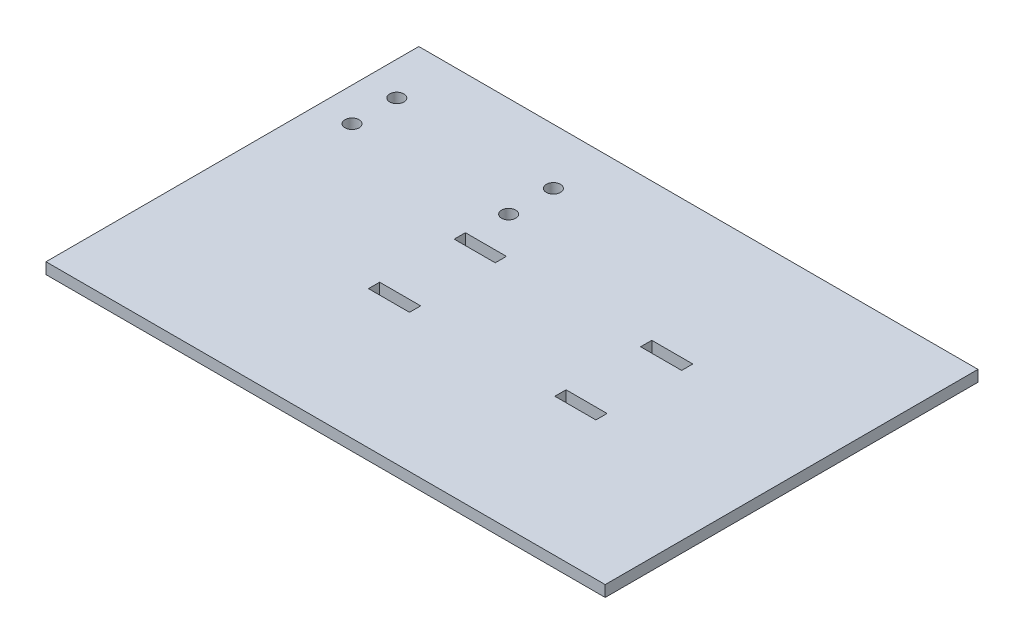
ISO-10303-21;
HEADER;
FILE_DESCRIPTION(('STEP AP214'),'2;1');
FILE_NAME('part.step','',(''),(''),'','','');
FILE_SCHEMA(('AUTOMOTIVE_DESIGN { 1 0 10303 214 1 1 1 1 }'));
ENDSEC;
DATA;
#1=APPLICATION_CONTEXT('core data for automotive mechanical design processes');
#2=APPLICATION_PROTOCOL_DEFINITION('international standard','automotive_design',2000,#1);
#3=PRODUCT_CONTEXT('',#1,'mechanical');
#4=PRODUCT('Part','Part','',(#3));
#5=PRODUCT_RELATED_PRODUCT_CATEGORY('part','',(#4));
#6=PRODUCT_DEFINITION_FORMATION('','',#4);
#7=PRODUCT_DEFINITION_CONTEXT('part definition',#1,'design');
#8=PRODUCT_DEFINITION('design','',#6,#7);
#9=PRODUCT_DEFINITION_SHAPE('','',#8);
#10=(LENGTH_UNIT() NAMED_UNIT(*) SI_UNIT(.MILLI.,.METRE.));
#11=(NAMED_UNIT(*) PLANE_ANGLE_UNIT() SI_UNIT($,.RADIAN.));
#12=(NAMED_UNIT(*) SI_UNIT($,.STERADIAN.) SOLID_ANGLE_UNIT());
#13=UNCERTAINTY_MEASURE_WITH_UNIT(LENGTH_MEASURE(1.E-05),#10,'distance_accuracy_value','');
#14=(GEOMETRIC_REPRESENTATION_CONTEXT(3) GLOBAL_UNCERTAINTY_ASSIGNED_CONTEXT((#13)) GLOBAL_UNIT_ASSIGNED_CONTEXT((#10,
#11,#12)) REPRESENTATION_CONTEXT('',''));
#15=CARTESIAN_POINT('',(0.,0.,0.));
#16=DIRECTION('',(0.,0.,1.));
#17=DIRECTION('',(1.,0.,0.));
#18=AXIS2_PLACEMENT_3D('',#15,#16,#17);
#19=CARTESIAN_POINT('',(120.,-3.,-50.));
#20=DIRECTION('',(1.,0.,0.));
#21=DIRECTION('',(0.,0.,-1.));
#22=AXIS2_PLACEMENT_3D('',#19,#20,#21);
#23=PLANE('',#22);
#24=DIRECTION('',(0.,0.,-1.));
#25=VECTOR('',#24,1.);
#26=CARTESIAN_POINT('',(120.,0.,-50.));
#27=LINE('',#26,#25);
#28=CARTESIAN_POINT('',(120.,0.,50.));
#29=VERTEX_POINT('',#28);
#30=CARTESIAN_POINT('',(120.,0.,-50.));
#31=VERTEX_POINT('',#30);
#32=EDGE_CURVE('E272',#29,#31,#27,.T.);
#33=ORIENTED_EDGE('',*,*,#32,.F.);
#34=DIRECTION('',(0.,1.,0.));
#35=VECTOR('',#34,1.);
#36=CARTESIAN_POINT('',(120.,-3.,50.));
#37=LINE('',#36,#35);
#38=CARTESIAN_POINT('',(120.,-3.,50.));
#39=VERTEX_POINT('',#38);
#40=EDGE_CURVE('E297',#39,#29,#37,.T.);
#41=ORIENTED_EDGE('',*,*,#40,.F.);
#42=DIRECTION('',(0.,0.,-1.));
#43=VECTOR('',#42,1.);
#44=CARTESIAN_POINT('',(120.,-3.,-50.));
#45=LINE('',#44,#43);
#46=CARTESIAN_POINT('',(120.,-3.,-50.));
#47=VERTEX_POINT('',#46);
#48=EDGE_CURVE('E273',#39,#47,#45,.T.);
#49=ORIENTED_EDGE('',*,*,#48,.T.);
#50=DIRECTION('',(0.,1.,0.));
#51=VECTOR('',#50,1.);
#52=CARTESIAN_POINT('',(120.,-3.,-50.));
#53=LINE('',#52,#51);
#54=EDGE_CURVE('E286',#47,#31,#53,.T.);
#55=ORIENTED_EDGE('',*,*,#54,.T.);
#56=EDGE_LOOP('',(#33,#41,#49,#55));
#57=FACE_BOUND('',#56,.T.);
#58=ADVANCED_FACE('F36',(#57),#23,.T.);
#59=CARTESIAN_POINT('',(-30.,-3.,50.));
#60=DIRECTION('',(0.,0.,1.));
#61=DIRECTION('',(1.,0.,0.));
#62=AXIS2_PLACEMENT_3D('',#59,#60,#61);
#63=PLANE('',#62);
#64=DIRECTION('',(1.,0.,0.));
#65=VECTOR('',#64,1.);
#66=CARTESIAN_POINT('',(-30.,0.,50.));
#67=LINE('',#66,#65);
#68=CARTESIAN_POINT('',(-30.,0.,50.));
#69=VERTEX_POINT('',#68);
#70=EDGE_CURVE('E277',#69,#29,#67,.T.);
#71=ORIENTED_EDGE('',*,*,#70,.F.);
#72=DIRECTION('',(0.,1.,0.));
#73=VECTOR('',#72,1.);
#74=CARTESIAN_POINT('',(-30.,-3.,50.));
#75=LINE('',#74,#73);
#76=CARTESIAN_POINT('',(-30.,-3.,50.));
#77=VERTEX_POINT('',#76);
#78=EDGE_CURVE('E300',#77,#69,#75,.T.);
#79=ORIENTED_EDGE('',*,*,#78,.F.);
#80=DIRECTION('',(1.,0.,0.));
#81=VECTOR('',#80,1.);
#82=CARTESIAN_POINT('',(-30.,-3.,50.));
#83=LINE('',#82,#81);
#84=EDGE_CURVE('E283',#77,#39,#83,.T.);
#85=ORIENTED_EDGE('',*,*,#84,.T.);
#86=ORIENTED_EDGE('',*,*,#40,.T.);
#87=EDGE_LOOP('',(#71,#79,#85,#86));
#88=FACE_BOUND('',#87,.T.);
#89=ADVANCED_FACE('F378',(#88),#63,.T.);
#90=CARTESIAN_POINT('',(-30.,-3.,-50.));
#91=DIRECTION('',(-1.,0.,0.));
#92=DIRECTION('',(0.,0.,1.));
#93=AXIS2_PLACEMENT_3D('',#90,#91,#92);
#94=PLANE('',#93);
#95=DIRECTION('',(0.,0.,1.));
#96=VECTOR('',#95,1.);
#97=CARTESIAN_POINT('',(-30.,0.,-50.));
#98=LINE('',#97,#96);
#99=CARTESIAN_POINT('',(-30.,0.,-50.));
#100=VERTEX_POINT('',#99);
#101=EDGE_CURVE('E292',#100,#69,#98,.T.);
#102=ORIENTED_EDGE('',*,*,#101,.F.);
#103=DIRECTION('',(0.,1.,0.));
#104=VECTOR('',#103,1.);
#105=CARTESIAN_POINT('',(-30.,-3.,-50.));
#106=LINE('',#105,#104);
#107=CARTESIAN_POINT('',(-30.,-3.,-50.));
#108=VERTEX_POINT('',#107);
#109=EDGE_CURVE('E302',#108,#100,#106,.T.);
#110=ORIENTED_EDGE('',*,*,#109,.F.);
#111=DIRECTION('',(0.,0.,1.));
#112=VECTOR('',#111,1.);
#113=CARTESIAN_POINT('',(-30.,-3.,-50.));
#114=LINE('',#113,#112);
#115=EDGE_CURVE('E280',#108,#77,#114,.T.);
#116=ORIENTED_EDGE('',*,*,#115,.T.);
#117=ORIENTED_EDGE('',*,*,#78,.T.);
#118=EDGE_LOOP('',(#102,#110,#116,#117));
#119=FACE_BOUND('',#118,.T.);
#120=ADVANCED_FACE('F384',(#119),#94,.T.);
#121=CARTESIAN_POINT('',(-30.,-3.,-50.));
#122=DIRECTION('',(0.,0.,-1.));
#123=DIRECTION('',(-1.,0.,0.));
#124=AXIS2_PLACEMENT_3D('',#121,#122,#123);
#125=PLANE('',#124);
#126=DIRECTION('',(-1.,0.,0.));
#127=VECTOR('',#126,1.);
#128=CARTESIAN_POINT('',(-30.,0.,-50.));
#129=LINE('',#128,#127);
#130=EDGE_CURVE('E289',#31,#100,#129,.T.);
#131=ORIENTED_EDGE('',*,*,#130,.F.);
#132=ORIENTED_EDGE('',*,*,#54,.F.);
#133=DIRECTION('',(-1.,0.,0.));
#134=VECTOR('',#133,1.);
#135=CARTESIAN_POINT('',(-30.,-3.,-50.));
#136=LINE('',#135,#134);
#137=EDGE_CURVE('E276',#47,#108,#136,.T.);
#138=ORIENTED_EDGE('',*,*,#137,.T.);
#139=ORIENTED_EDGE('',*,*,#109,.T.);
#140=EDGE_LOOP('',(#131,#132,#138,#139));
#141=FACE_BOUND('',#140,.T.);
#142=ADVANCED_FACE('F390',(#141),#125,.T.);
#143=CARTESIAN_POINT('',(0.,-3.,0.));
#144=DIRECTION('',(0.,1.,0.));
#145=DIRECTION('',(0.,0.,1.));
#146=AXIS2_PLACEMENT_3D('',#143,#144,#145);
#147=PLANE('',#146);
#148=DIRECTION('',(-1.,0.,0.));
#149=VECTOR('',#148,1.);
#150=CARTESIAN_POINT('',(69.5,-3.,-13.));
#151=LINE('',#150,#149);
#152=CARTESIAN_POINT('',(80.5,-3.,-13.));
#153=VERTEX_POINT('',#152);
#154=CARTESIAN_POINT('',(69.5,-3.,-13.));
#155=VERTEX_POINT('',#154);
#156=EDGE_CURVE('E208',#153,#155,#151,.T.);
#157=ORIENTED_EDGE('',*,*,#156,.T.);
#158=DIRECTION('',(0.,0.,1.));
#159=VECTOR('',#158,1.);
#160=CARTESIAN_POINT('',(69.5,-3.,-10.));
#161=LINE('',#160,#159);
#162=CARTESIAN_POINT('',(69.5,-3.,-10.));
#163=VERTEX_POINT('',#162);
#164=EDGE_CURVE('E213',#155,#163,#161,.T.);
#165=ORIENTED_EDGE('',*,*,#164,.T.);
#166=DIRECTION('',(1.,0.,0.));
#167=VECTOR('',#166,1.);
#168=CARTESIAN_POINT('',(69.5,-3.,-10.));
#169=LINE('',#168,#167);
#170=CARTESIAN_POINT('',(80.5,-3.,-10.));
#171=VERTEX_POINT('',#170);
#172=EDGE_CURVE('E185',#163,#171,#169,.T.);
#173=ORIENTED_EDGE('',*,*,#172,.T.);
#174=DIRECTION('',(0.,0.,-1.));
#175=VECTOR('',#174,1.);
#176=CARTESIAN_POINT('',(80.5,-3.,-10.));
#177=LINE('',#176,#175);
#178=EDGE_CURVE('E192',#171,#153,#177,.T.);
#179=ORIENTED_EDGE('',*,*,#178,.T.);
#180=EDGE_LOOP('',(#157,#165,#173,#179));
#181=FACE_BOUND('',#180,.T.);
#182=DIRECTION('',(-1.,0.,0.));
#183=VECTOR('',#182,1.);
#184=CARTESIAN_POINT('',(19.5,-3.,-13.));
#185=LINE('',#184,#183);
#186=CARTESIAN_POINT('',(30.5,-3.,-13.));
#187=VERTEX_POINT('',#186);
#188=CARTESIAN_POINT('',(19.5,-3.,-13.));
#189=VERTEX_POINT('',#188);
#190=EDGE_CURVE('E227',#187,#189,#185,.T.);
#191=ORIENTED_EDGE('',*,*,#190,.T.);
#192=DIRECTION('',(0.,0.,1.));
#193=VECTOR('',#192,1.);
#194=CARTESIAN_POINT('',(19.5,-3.,-10.));
#195=LINE('',#194,#193);
#196=CARTESIAN_POINT('',(19.5,-3.,-10.));
#197=VERTEX_POINT('',#196);
#198=EDGE_CURVE('E217',#189,#197,#195,.T.);
#199=ORIENTED_EDGE('',*,*,#198,.T.);
#200=DIRECTION('',(1.,0.,0.));
#201=VECTOR('',#200,1.);
#202=CARTESIAN_POINT('',(19.5,-3.,-10.));
#203=LINE('',#202,#201);
#204=CARTESIAN_POINT('',(30.5,-3.,-10.));
#205=VERTEX_POINT('',#204);
#206=EDGE_CURVE('E220',#197,#205,#203,.T.);
#207=ORIENTED_EDGE('',*,*,#206,.T.);
#208=DIRECTION('',(0.,0.,-1.));
#209=VECTOR('',#208,1.);
#210=CARTESIAN_POINT('',(30.5,-3.,-10.));
#211=LINE('',#210,#209);
#212=EDGE_CURVE('E224',#205,#187,#211,.T.);
#213=ORIENTED_EDGE('',*,*,#212,.T.);
#214=EDGE_LOOP('',(#191,#199,#207,#213));
#215=FACE_BOUND('',#214,.T.);
#216=CARTESIAN_POINT('',(-21.,-3.,-23.1));
#217=DIRECTION('',(0.,1.,0.));
#218=DIRECTION('',(0.,0.,1.));
#219=AXIS2_PLACEMENT_3D('',#216,#217,#218);
#220=CIRCLE('',#219,1.89865);
#221=CARTESIAN_POINT('',(-21.,-3.,-21.20135));
#222=VERTEX_POINT('',#221);
#223=EDGE_CURVE('E251',#222,#222,#220,.T.);
#224=ORIENTED_EDGE('',*,*,#223,.T.);
#225=EDGE_LOOP('',(#224));
#226=FACE_BOUND('',#225,.T.);
#227=CARTESIAN_POINT('',(21.,-3.,-23.1));
#228=DIRECTION('',(0.,1.,0.));
#229=DIRECTION('',(0.,0.,1.));
#230=AXIS2_PLACEMENT_3D('',#227,#228,#229);
#231=CIRCLE('',#230,1.89865);
#232=CARTESIAN_POINT('',(21.,-3.,-21.20135));
#233=VERTEX_POINT('',#232);
#234=EDGE_CURVE('E257',#233,#233,#231,.T.);
#235=ORIENTED_EDGE('',*,*,#234,.T.);
#236=EDGE_LOOP('',(#235));
#237=FACE_BOUND('',#236,.T.);
#238=CARTESIAN_POINT('',(21.,-3.,-35.1));
#239=DIRECTION('',(0.,1.,0.));
#240=DIRECTION('',(0.,0.,1.));
#241=AXIS2_PLACEMENT_3D('',#238,#239,#240);
#242=CIRCLE('',#241,1.89865);
#243=CARTESIAN_POINT('',(21.,-3.,-33.20135));
#244=VERTEX_POINT('',#243);
#245=EDGE_CURVE('E263',#244,#244,#242,.T.);
#246=ORIENTED_EDGE('',*,*,#245,.T.);
#247=EDGE_LOOP('',(#246));
#248=FACE_BOUND('',#247,.T.);
#249=CARTESIAN_POINT('',(-21.,-3.,-35.1));
#250=DIRECTION('',(0.,1.,0.));
#251=DIRECTION('',(0.,0.,1.));
#252=AXIS2_PLACEMENT_3D('',#249,#250,#251);
#253=CIRCLE('',#252,1.89865);
#254=CARTESIAN_POINT('',(-21.,-3.,-33.20135));
#255=VERTEX_POINT('',#254);
#256=EDGE_CURVE('E269',#255,#255,#253,.T.);
#257=ORIENTED_EDGE('',*,*,#256,.T.);
#258=EDGE_LOOP('',(#257));
#259=FACE_BOUND('',#258,.T.);
#260=ORIENTED_EDGE('',*,*,#48,.F.);
#261=ORIENTED_EDGE('',*,*,#84,.F.);
#262=ORIENTED_EDGE('',*,*,#115,.F.);
#263=ORIENTED_EDGE('',*,*,#137,.F.);
#264=EDGE_LOOP('',(#260,#261,#262,#263));
#265=FACE_BOUND('',#264,.T.);
#266=DIRECTION('',(0.,0.,1.));
#267=VECTOR('',#266,1.);
#268=CARTESIAN_POINT('',(19.5,-3.,13.));
#269=LINE('',#268,#267);
#270=CARTESIAN_POINT('',(19.5,-3.,10.));
#271=VERTEX_POINT('',#270);
#272=CARTESIAN_POINT('',(19.5,-3.,13.));
#273=VERTEX_POINT('',#272);
#274=EDGE_CURVE('E315',#271,#273,#269,.T.);
#275=ORIENTED_EDGE('',*,*,#274,.T.);
#276=DIRECTION('',(1.,0.,0.));
#277=VECTOR('',#276,1.);
#278=CARTESIAN_POINT('',(19.5,-3.,13.));
#279=LINE('',#278,#277);
#280=CARTESIAN_POINT('',(30.5,-3.,13.));
#281=VERTEX_POINT('',#280);
#282=EDGE_CURVE('E317',#273,#281,#279,.T.);
#283=ORIENTED_EDGE('',*,*,#282,.T.);
#284=DIRECTION('',(0.,0.,-1.));
#285=VECTOR('',#284,1.);
#286=CARTESIAN_POINT('',(30.5,-3.,13.));
#287=LINE('',#286,#285);
#288=CARTESIAN_POINT('',(30.5,-3.,10.));
#289=VERTEX_POINT('',#288);
#290=EDGE_CURVE('E319',#281,#289,#287,.T.);
#291=ORIENTED_EDGE('',*,*,#290,.T.);
#292=DIRECTION('',(-1.,0.,0.));
#293=VECTOR('',#292,1.);
#294=CARTESIAN_POINT('',(19.5,-3.,10.));
#295=LINE('',#294,#293);
#296=EDGE_CURVE('E321',#289,#271,#295,.T.);
#297=ORIENTED_EDGE('',*,*,#296,.T.);
#298=EDGE_LOOP('',(#275,#283,#291,#297));
#299=FACE_BOUND('',#298,.T.);
#300=DIRECTION('',(0.,0.,1.));
#301=VECTOR('',#300,1.);
#302=CARTESIAN_POINT('',(69.5,-3.,13.));
#303=LINE('',#302,#301);
#304=CARTESIAN_POINT('',(69.5,-3.,10.));
#305=VERTEX_POINT('',#304);
#306=CARTESIAN_POINT('',(69.5,-3.,13.));
#307=VERTEX_POINT('',#306);
#308=EDGE_CURVE('E51',#305,#307,#303,.T.);
#309=ORIENTED_EDGE('',*,*,#308,.T.);
#310=DIRECTION('',(1.,0.,0.));
#311=VECTOR('',#310,1.);
#312=CARTESIAN_POINT('',(69.5,-3.,13.));
#313=LINE('',#312,#311);
#314=CARTESIAN_POINT('',(80.5,-3.,13.));
#315=VERTEX_POINT('',#314);
#316=EDGE_CURVE('E348',#307,#315,#313,.T.);
#317=ORIENTED_EDGE('',*,*,#316,.T.);
#318=DIRECTION('',(0.,0.,-1.));
#319=VECTOR('',#318,1.);
#320=CARTESIAN_POINT('',(80.5,-3.,13.));
#321=LINE('',#320,#319);
#322=CARTESIAN_POINT('',(80.5,-3.,10.));
#323=VERTEX_POINT('',#322);
#324=EDGE_CURVE('E58',#315,#323,#321,.T.);
#325=ORIENTED_EDGE('',*,*,#324,.T.);
#326=DIRECTION('',(-1.,0.,0.));
#327=VECTOR('',#326,1.);
#328=CARTESIAN_POINT('',(69.5,-3.,10.));
#329=LINE('',#328,#327);
#330=EDGE_CURVE('E351',#323,#305,#329,.T.);
#331=ORIENTED_EDGE('',*,*,#330,.T.);
#332=EDGE_LOOP('',(#309,#317,#325,#331));
#333=FACE_BOUND('',#332,.T.);
#334=ADVANCED_FACE('F419',(#181,#215,#226,#237,#248,#259,#265,#299,#333),#147,.F.);
#335=CARTESIAN_POINT('',(0.,0.,0.));
#336=DIRECTION('',(0.,1.,0.));
#337=DIRECTION('',(0.,0.,1.));
#338=AXIS2_PLACEMENT_3D('',#335,#336,#337);
#339=PLANE('',#338);
#340=DIRECTION('',(0.,0.,1.));
#341=VECTOR('',#340,1.);
#342=CARTESIAN_POINT('',(69.5,0.,-10.));
#343=LINE('',#342,#341);
#344=CARTESIAN_POINT('',(69.5,0.,-13.));
#345=VERTEX_POINT('',#344);
#346=CARTESIAN_POINT('',(69.5,0.,-10.));
#347=VERTEX_POINT('',#346);
#348=EDGE_CURVE('E211',#345,#347,#343,.T.);
#349=ORIENTED_EDGE('',*,*,#348,.F.);
#350=DIRECTION('',(-1.,0.,0.));
#351=VECTOR('',#350,1.);
#352=CARTESIAN_POINT('',(69.5,0.,-13.));
#353=LINE('',#352,#351);
#354=CARTESIAN_POINT('',(80.5,0.,-13.));
#355=VERTEX_POINT('',#354);
#356=EDGE_CURVE('E197',#355,#345,#353,.T.);
#357=ORIENTED_EDGE('',*,*,#356,.F.);
#358=DIRECTION('',(0.,0.,-1.));
#359=VECTOR('',#358,1.);
#360=CARTESIAN_POINT('',(80.5,0.,-10.));
#361=LINE('',#360,#359);
#362=CARTESIAN_POINT('',(80.5,0.,-10.));
#363=VERTEX_POINT('',#362);
#364=EDGE_CURVE('E189',#363,#355,#361,.T.);
#365=ORIENTED_EDGE('',*,*,#364,.F.);
#366=DIRECTION('',(1.,0.,0.));
#367=VECTOR('',#366,1.);
#368=CARTESIAN_POINT('',(69.5,0.,-10.));
#369=LINE('',#368,#367);
#370=EDGE_CURVE('E175',#347,#363,#369,.T.);
#371=ORIENTED_EDGE('',*,*,#370,.F.);
#372=EDGE_LOOP('',(#349,#357,#365,#371));
#373=FACE_BOUND('',#372,.T.);
#374=DIRECTION('',(0.,0.,1.));
#375=VECTOR('',#374,1.);
#376=CARTESIAN_POINT('',(19.5,0.,-10.));
#377=LINE('',#376,#375);
#378=CARTESIAN_POINT('',(19.5,0.,-13.));
#379=VERTEX_POINT('',#378);
#380=CARTESIAN_POINT('',(19.5,0.,-10.));
#381=VERTEX_POINT('',#380);
#382=EDGE_CURVE('E216',#379,#381,#377,.T.);
#383=ORIENTED_EDGE('',*,*,#382,.F.);
#384=DIRECTION('',(-1.,0.,0.));
#385=VECTOR('',#384,1.);
#386=CARTESIAN_POINT('',(19.5,0.,-13.));
#387=LINE('',#386,#385);
#388=CARTESIAN_POINT('',(30.5,0.,-13.));
#389=VERTEX_POINT('',#388);
#390=EDGE_CURVE('E221',#389,#379,#387,.T.);
#391=ORIENTED_EDGE('',*,*,#390,.F.);
#392=DIRECTION('',(0.,0.,-1.));
#393=VECTOR('',#392,1.);
#394=CARTESIAN_POINT('',(30.5,0.,-10.));
#395=LINE('',#394,#393);
#396=CARTESIAN_POINT('',(30.5,0.,-10.));
#397=VERTEX_POINT('',#396);
#398=EDGE_CURVE('E235',#397,#389,#395,.T.);
#399=ORIENTED_EDGE('',*,*,#398,.F.);
#400=DIRECTION('',(1.,0.,0.));
#401=VECTOR('',#400,1.);
#402=CARTESIAN_POINT('',(19.5,0.,-10.));
#403=LINE('',#402,#401);
#404=EDGE_CURVE('E232',#381,#397,#403,.T.);
#405=ORIENTED_EDGE('',*,*,#404,.F.);
#406=EDGE_LOOP('',(#383,#391,#399,#405));
#407=FACE_BOUND('',#406,.T.);
#408=CARTESIAN_POINT('',(-21.,0.,-23.1));
#409=DIRECTION('',(0.,1.,0.));
#410=DIRECTION('',(0.,0.,1.));
#411=AXIS2_PLACEMENT_3D('',#408,#409,#410);
#412=CIRCLE('',#411,1.89865);
#413=CARTESIAN_POINT('',(-21.,0.,-21.20135));
#414=VERTEX_POINT('',#413);
#415=EDGE_CURVE('E242',#414,#414,#412,.T.);
#416=ORIENTED_EDGE('',*,*,#415,.F.);
#417=EDGE_LOOP('',(#416));
#418=FACE_BOUND('',#417,.T.);
#419=CARTESIAN_POINT('',(21.,0.,-23.1));
#420=DIRECTION('',(0.,1.,0.));
#421=DIRECTION('',(0.,0.,1.));
#422=AXIS2_PLACEMENT_3D('',#419,#420,#421);
#423=CIRCLE('',#422,1.89865);
#424=CARTESIAN_POINT('',(21.,0.,-21.20135));
#425=VERTEX_POINT('',#424);
#426=EDGE_CURVE('E254',#425,#425,#423,.T.);
#427=ORIENTED_EDGE('',*,*,#426,.F.);
#428=EDGE_LOOP('',(#427));
#429=FACE_BOUND('',#428,.T.);
#430=CARTESIAN_POINT('',(21.,0.,-35.1));
#431=DIRECTION('',(0.,1.,0.));
#432=DIRECTION('',(0.,0.,1.));
#433=AXIS2_PLACEMENT_3D('',#430,#431,#432);
#434=CIRCLE('',#433,1.89865);
#435=CARTESIAN_POINT('',(21.,0.,-33.20135));
#436=VERTEX_POINT('',#435);
#437=EDGE_CURVE('E260',#436,#436,#434,.T.);
#438=ORIENTED_EDGE('',*,*,#437,.F.);
#439=EDGE_LOOP('',(#438));
#440=FACE_BOUND('',#439,.T.);
#441=CARTESIAN_POINT('',(-21.,0.,-35.1));
#442=DIRECTION('',(0.,1.,0.));
#443=DIRECTION('',(0.,0.,1.));
#444=AXIS2_PLACEMENT_3D('',#441,#442,#443);
#445=CIRCLE('',#444,1.89865);
#446=CARTESIAN_POINT('',(-21.,0.,-33.20135));
#447=VERTEX_POINT('',#446);
#448=EDGE_CURVE('E266',#447,#447,#445,.T.);
#449=ORIENTED_EDGE('',*,*,#448,.F.);
#450=EDGE_LOOP('',(#449));
#451=FACE_BOUND('',#450,.T.);
#452=ORIENTED_EDGE('',*,*,#32,.T.);
#453=ORIENTED_EDGE('',*,*,#130,.T.);
#454=ORIENTED_EDGE('',*,*,#101,.T.);
#455=ORIENTED_EDGE('',*,*,#70,.T.);
#456=EDGE_LOOP('',(#452,#453,#454,#455));
#457=FACE_BOUND('',#456,.T.);
#458=DIRECTION('',(0.,0.,1.));
#459=VECTOR('',#458,1.);
#460=CARTESIAN_POINT('',(19.5,0.,13.));
#461=LINE('',#460,#459);
#462=CARTESIAN_POINT('',(19.5,0.,10.));
#463=VERTEX_POINT('',#462);
#464=CARTESIAN_POINT('',(19.5,0.,13.));
#465=VERTEX_POINT('',#464);
#466=EDGE_CURVE('E299',#463,#465,#461,.T.);
#467=ORIENTED_EDGE('',*,*,#466,.F.);
#468=DIRECTION('',(-1.,0.,0.));
#469=VECTOR('',#468,1.);
#470=CARTESIAN_POINT('',(19.5,0.,10.));
#471=LINE('',#470,#469);
#472=CARTESIAN_POINT('',(30.5,0.,10.));
#473=VERTEX_POINT('',#472);
#474=EDGE_CURVE('E306',#473,#463,#471,.T.);
#475=ORIENTED_EDGE('',*,*,#474,.F.);
#476=DIRECTION('',(0.,0.,-1.));
#477=VECTOR('',#476,1.);
#478=CARTESIAN_POINT('',(30.5,0.,13.));
#479=LINE('',#478,#477);
#480=CARTESIAN_POINT('',(30.5,0.,13.));
#481=VERTEX_POINT('',#480);
#482=EDGE_CURVE('E309',#481,#473,#479,.T.);
#483=ORIENTED_EDGE('',*,*,#482,.F.);
#484=DIRECTION('',(1.,0.,0.));
#485=VECTOR('',#484,1.);
#486=CARTESIAN_POINT('',(19.5,0.,13.));
#487=LINE('',#486,#485);
#488=EDGE_CURVE('E312',#465,#481,#487,.T.);
#489=ORIENTED_EDGE('',*,*,#488,.F.);
#490=EDGE_LOOP('',(#467,#475,#483,#489));
#491=FACE_BOUND('',#490,.T.);
#492=DIRECTION('',(0.,0.,1.));
#493=VECTOR('',#492,1.);
#494=CARTESIAN_POINT('',(69.5,0.,13.));
#495=LINE('',#494,#493);
#496=CARTESIAN_POINT('',(69.5,0.,10.));
#497=VERTEX_POINT('',#496);
#498=CARTESIAN_POINT('',(69.5,0.,13.));
#499=VERTEX_POINT('',#498);
#500=EDGE_CURVE('E336',#497,#499,#495,.T.);
#501=ORIENTED_EDGE('',*,*,#500,.F.);
#502=DIRECTION('',(-1.,0.,0.));
#503=VECTOR('',#502,1.);
#504=CARTESIAN_POINT('',(69.5,0.,10.));
#505=LINE('',#504,#503);
#506=CARTESIAN_POINT('',(80.5,0.,10.));
#507=VERTEX_POINT('',#506);
#508=EDGE_CURVE('E338',#507,#497,#505,.T.);
#509=ORIENTED_EDGE('',*,*,#508,.F.);
#510=DIRECTION('',(0.,0.,-1.));
#511=VECTOR('',#510,1.);
#512=CARTESIAN_POINT('',(80.5,0.,13.));
#513=LINE('',#512,#511);
#514=CARTESIAN_POINT('',(80.5,0.,13.));
#515=VERTEX_POINT('',#514);
#516=EDGE_CURVE('E341',#515,#507,#513,.T.);
#517=ORIENTED_EDGE('',*,*,#516,.F.);
#518=DIRECTION('',(1.,0.,0.));
#519=VECTOR('',#518,1.);
#520=CARTESIAN_POINT('',(69.5,0.,13.));
#521=LINE('',#520,#519);
#522=EDGE_CURVE('E344',#499,#515,#521,.T.);
#523=ORIENTED_EDGE('',*,*,#522,.F.);
#524=EDGE_LOOP('',(#501,#509,#517,#523));
#525=FACE_BOUND('',#524,.T.);
#526=ADVANCED_FACE('F195',(#373,#407,#418,#429,#440,#451,#457,#491,#525),#339,.T.);
#527=CARTESIAN_POINT('',(-21.,0.,-35.1));
#528=DIRECTION('',(0.,1.,0.));
#529=DIRECTION('',(0.,0.,1.));
#530=AXIS2_PLACEMENT_3D('',#527,#528,#529);
#531=CYLINDRICAL_SURFACE('',#530,1.89865);
#532=ORIENTED_EDGE('',*,*,#256,.F.);
#533=EDGE_LOOP('',(#532));
#534=FACE_BOUND('',#533,.T.);
#535=ORIENTED_EDGE('',*,*,#448,.T.);
#536=EDGE_LOOP('',(#535));
#537=FACE_BOUND('',#536,.T.);
#538=ADVANCED_FACE('F422',(#534,#537),#531,.F.);
#539=CARTESIAN_POINT('',(21.,0.,-35.1));
#540=DIRECTION('',(0.,1.,0.));
#541=DIRECTION('',(0.,0.,1.));
#542=AXIS2_PLACEMENT_3D('',#539,#540,#541);
#543=CYLINDRICAL_SURFACE('',#542,1.89865);
#544=ORIENTED_EDGE('',*,*,#245,.F.);
#545=EDGE_LOOP('',(#544));
#546=FACE_BOUND('',#545,.T.);
#547=ORIENTED_EDGE('',*,*,#437,.T.);
#548=EDGE_LOOP('',(#547));
#549=FACE_BOUND('',#548,.T.);
#550=ADVANCED_FACE('F428',(#546,#549),#543,.F.);
#551=CARTESIAN_POINT('',(21.,0.,-23.1));
#552=DIRECTION('',(0.,1.,0.));
#553=DIRECTION('',(0.,0.,1.));
#554=AXIS2_PLACEMENT_3D('',#551,#552,#553);
#555=CYLINDRICAL_SURFACE('',#554,1.89865);
#556=ORIENTED_EDGE('',*,*,#234,.F.);
#557=EDGE_LOOP('',(#556));
#558=FACE_BOUND('',#557,.T.);
#559=ORIENTED_EDGE('',*,*,#426,.T.);
#560=EDGE_LOOP('',(#559));
#561=FACE_BOUND('',#560,.T.);
#562=ADVANCED_FACE('F568',(#558,#561),#555,.F.);
#563=CARTESIAN_POINT('',(-21.,0.,-23.1));
#564=DIRECTION('',(0.,1.,0.));
#565=DIRECTION('',(0.,0.,1.));
#566=AXIS2_PLACEMENT_3D('',#563,#564,#565);
#567=CYLINDRICAL_SURFACE('',#566,1.89865);
#568=ORIENTED_EDGE('',*,*,#223,.F.);
#569=EDGE_LOOP('',(#568));
#570=FACE_BOUND('',#569,.T.);
#571=ORIENTED_EDGE('',*,*,#415,.T.);
#572=EDGE_LOOP('',(#571));
#573=FACE_BOUND('',#572,.T.);
#574=ADVANCED_FACE('F564',(#570,#573),#567,.F.);
#575=CARTESIAN_POINT('',(19.5,-3.,-10.));
#576=DIRECTION('',(-1.,0.,0.));
#577=DIRECTION('',(0.,0.,1.));
#578=AXIS2_PLACEMENT_3D('',#575,#576,#577);
#579=PLANE('',#578);
#580=ORIENTED_EDGE('',*,*,#382,.T.);
#581=DIRECTION('',(0.,1.,0.));
#582=VECTOR('',#581,1.);
#583=CARTESIAN_POINT('',(19.5,-3.,-10.));
#584=LINE('',#583,#582);
#585=EDGE_CURVE('E230',#197,#381,#584,.T.);
#586=ORIENTED_EDGE('',*,*,#585,.F.);
#587=ORIENTED_EDGE('',*,*,#198,.F.);
#588=DIRECTION('',(0.,1.,0.));
#589=VECTOR('',#588,1.);
#590=CARTESIAN_POINT('',(19.5,-3.,-13.));
#591=LINE('',#590,#589);
#592=EDGE_CURVE('E240',#189,#379,#591,.T.);
#593=ORIENTED_EDGE('',*,*,#592,.T.);
#594=EDGE_LOOP('',(#580,#586,#587,#593));
#595=FACE_BOUND('',#594,.T.);
#596=ADVANCED_FACE('F555',(#595),#579,.F.);
#597=CARTESIAN_POINT('',(19.5,-3.,-13.));
#598=DIRECTION('',(0.,0.,-1.));
#599=DIRECTION('',(-1.,0.,0.));
#600=AXIS2_PLACEMENT_3D('',#597,#598,#599);
#601=PLANE('',#600);
#602=ORIENTED_EDGE('',*,*,#390,.T.);
#603=ORIENTED_EDGE('',*,*,#592,.F.);
#604=ORIENTED_EDGE('',*,*,#190,.F.);
#605=DIRECTION('',(0.,1.,0.));
#606=VECTOR('',#605,1.);
#607=CARTESIAN_POINT('',(30.5,-3.,-13.));
#608=LINE('',#607,#606);
#609=EDGE_CURVE('E243',#187,#389,#608,.T.);
#610=ORIENTED_EDGE('',*,*,#609,.T.);
#611=EDGE_LOOP('',(#602,#603,#604,#610));
#612=FACE_BOUND('',#611,.T.);
#613=ADVANCED_FACE('F551',(#612),#601,.F.);
#614=CARTESIAN_POINT('',(30.5,-3.,-10.));
#615=DIRECTION('',(1.,0.,0.));
#616=DIRECTION('',(0.,0.,-1.));
#617=AXIS2_PLACEMENT_3D('',#614,#615,#616);
#618=PLANE('',#617);
#619=ORIENTED_EDGE('',*,*,#398,.T.);
#620=ORIENTED_EDGE('',*,*,#609,.F.);
#621=ORIENTED_EDGE('',*,*,#212,.F.);
#622=DIRECTION('',(0.,1.,0.));
#623=VECTOR('',#622,1.);
#624=CARTESIAN_POINT('',(30.5,-3.,-10.));
#625=LINE('',#624,#623);
#626=EDGE_CURVE('E245',#205,#397,#625,.T.);
#627=ORIENTED_EDGE('',*,*,#626,.T.);
#628=EDGE_LOOP('',(#619,#620,#621,#627));
#629=FACE_BOUND('',#628,.T.);
#630=ADVANCED_FACE('F554',(#629),#618,.F.);
#631=CARTESIAN_POINT('',(19.5,-3.,-10.));
#632=DIRECTION('',(0.,0.,1.));
#633=DIRECTION('',(1.,0.,0.));
#634=AXIS2_PLACEMENT_3D('',#631,#632,#633);
#635=PLANE('',#634);
#636=ORIENTED_EDGE('',*,*,#404,.T.);
#637=ORIENTED_EDGE('',*,*,#626,.F.);
#638=ORIENTED_EDGE('',*,*,#206,.F.);
#639=ORIENTED_EDGE('',*,*,#585,.T.);
#640=EDGE_LOOP('',(#636,#637,#638,#639));
#641=FACE_BOUND('',#640,.T.);
#642=ADVANCED_FACE('F461',(#641),#635,.F.);
#643=CARTESIAN_POINT('',(69.5,-3.,-10.));
#644=DIRECTION('',(-1.,0.,0.));
#645=DIRECTION('',(0.,0.,1.));
#646=AXIS2_PLACEMENT_3D('',#643,#644,#645);
#647=PLANE('',#646);
#648=ORIENTED_EDGE('',*,*,#348,.T.);
#649=DIRECTION('',(0.,1.,0.));
#650=VECTOR('',#649,1.);
#651=CARTESIAN_POINT('',(69.5,-3.,-10.));
#652=LINE('',#651,#650);
#653=EDGE_CURVE('E181',#163,#347,#652,.T.);
#654=ORIENTED_EDGE('',*,*,#653,.F.);
#655=ORIENTED_EDGE('',*,*,#164,.F.);
#656=DIRECTION('',(0.,1.,0.));
#657=VECTOR('',#656,1.);
#658=CARTESIAN_POINT('',(69.5,-3.,-13.));
#659=LINE('',#658,#657);
#660=EDGE_CURVE('E205',#155,#345,#659,.T.);
#661=ORIENTED_EDGE('',*,*,#660,.T.);
#662=EDGE_LOOP('',(#648,#654,#655,#661));
#663=FACE_BOUND('',#662,.T.);
#664=ADVANCED_FACE('F471',(#663),#647,.F.);
#665=CARTESIAN_POINT('',(69.5,-3.,-13.));
#666=DIRECTION('',(0.,0.,-1.));
#667=DIRECTION('',(-1.,0.,0.));
#668=AXIS2_PLACEMENT_3D('',#665,#666,#667);
#669=PLANE('',#668);
#670=ORIENTED_EDGE('',*,*,#356,.T.);
#671=ORIENTED_EDGE('',*,*,#660,.F.);
#672=ORIENTED_EDGE('',*,*,#156,.F.);
#673=DIRECTION('',(0.,1.,0.));
#674=VECTOR('',#673,1.);
#675=CARTESIAN_POINT('',(80.5,-3.,-13.));
#676=LINE('',#675,#674);
#677=EDGE_CURVE('E198',#153,#355,#676,.T.);
#678=ORIENTED_EDGE('',*,*,#677,.T.);
#679=EDGE_LOOP('',(#670,#671,#672,#678));
#680=FACE_BOUND('',#679,.T.);
#681=ADVANCED_FACE('F476',(#680),#669,.F.);
#682=CARTESIAN_POINT('',(80.5,-3.,-10.));
#683=DIRECTION('',(1.,0.,0.));
#684=DIRECTION('',(0.,0.,-1.));
#685=AXIS2_PLACEMENT_3D('',#682,#683,#684);
#686=PLANE('',#685);
#687=ORIENTED_EDGE('',*,*,#364,.T.);
#688=ORIENTED_EDGE('',*,*,#677,.F.);
#689=ORIENTED_EDGE('',*,*,#178,.F.);
#690=DIRECTION('',(0.,1.,0.));
#691=VECTOR('',#690,1.);
#692=CARTESIAN_POINT('',(80.5,-3.,-10.));
#693=LINE('',#692,#691);
#694=EDGE_CURVE('E178',#171,#363,#693,.T.);
#695=ORIENTED_EDGE('',*,*,#694,.T.);
#696=EDGE_LOOP('',(#687,#688,#689,#695));
#697=FACE_BOUND('',#696,.T.);
#698=ADVANCED_FACE('F188',(#697),#686,.F.);
#699=CARTESIAN_POINT('',(69.5,-3.,-10.));
#700=DIRECTION('',(0.,0.,1.));
#701=DIRECTION('',(1.,0.,0.));
#702=AXIS2_PLACEMENT_3D('',#699,#700,#701);
#703=PLANE('',#702);
#704=ORIENTED_EDGE('',*,*,#370,.T.);
#705=ORIENTED_EDGE('',*,*,#694,.F.);
#706=ORIENTED_EDGE('',*,*,#172,.F.);
#707=ORIENTED_EDGE('',*,*,#653,.T.);
#708=EDGE_LOOP('',(#704,#705,#706,#707));
#709=FACE_BOUND('',#708,.T.);
#710=ADVANCED_FACE('F177',(#709),#703,.F.);
#711=CARTESIAN_POINT('',(19.5,-3.,13.));
#712=DIRECTION('',(0.,0.,1.));
#713=DIRECTION('',(1.,0.,0.));
#714=AXIS2_PLACEMENT_3D('',#711,#712,#713);
#715=PLANE('',#714);
#716=ORIENTED_EDGE('',*,*,#488,.T.);
#717=DIRECTION('',(0.,1.,0.));
#718=VECTOR('',#717,1.);
#719=CARTESIAN_POINT('',(30.5,-3.,13.));
#720=LINE('',#719,#718);
#721=EDGE_CURVE('E333',#281,#481,#720,.T.);
#722=ORIENTED_EDGE('',*,*,#721,.F.);
#723=ORIENTED_EDGE('',*,*,#282,.F.);
#724=DIRECTION('',(0.,1.,0.));
#725=VECTOR('',#724,1.);
#726=CARTESIAN_POINT('',(19.5,-3.,13.));
#727=LINE('',#726,#725);
#728=EDGE_CURVE('E324',#273,#465,#727,.T.);
#729=ORIENTED_EDGE('',*,*,#728,.T.);
#730=EDGE_LOOP('',(#716,#722,#723,#729));
#731=FACE_BOUND('',#730,.T.);
#732=ADVANCED_FACE('F402',(#731),#715,.F.);
#733=CARTESIAN_POINT('',(30.5,-3.,13.));
#734=DIRECTION('',(1.,0.,0.));
#735=DIRECTION('',(0.,0.,-1.));
#736=AXIS2_PLACEMENT_3D('',#733,#734,#735);
#737=PLANE('',#736);
#738=ORIENTED_EDGE('',*,*,#482,.T.);
#739=DIRECTION('',(0.,1.,0.));
#740=VECTOR('',#739,1.);
#741=CARTESIAN_POINT('',(30.5,-3.,10.));
#742=LINE('',#741,#740);
#743=EDGE_CURVE('E330',#289,#473,#742,.T.);
#744=ORIENTED_EDGE('',*,*,#743,.F.);
#745=ORIENTED_EDGE('',*,*,#290,.F.);
#746=ORIENTED_EDGE('',*,*,#721,.T.);
#747=EDGE_LOOP('',(#738,#744,#745,#746));
#748=FACE_BOUND('',#747,.T.);
#749=ADVANCED_FACE('F399',(#748),#737,.F.);
#750=CARTESIAN_POINT('',(19.5,-3.,10.));
#751=DIRECTION('',(0.,0.,-1.));
#752=DIRECTION('',(-1.,0.,0.));
#753=AXIS2_PLACEMENT_3D('',#750,#751,#752);
#754=PLANE('',#753);
#755=ORIENTED_EDGE('',*,*,#474,.T.);
#756=DIRECTION('',(0.,1.,0.));
#757=VECTOR('',#756,1.);
#758=CARTESIAN_POINT('',(19.5,-3.,10.));
#759=LINE('',#758,#757);
#760=EDGE_CURVE('E327',#271,#463,#759,.T.);
#761=ORIENTED_EDGE('',*,*,#760,.F.);
#762=ORIENTED_EDGE('',*,*,#296,.F.);
#763=ORIENTED_EDGE('',*,*,#743,.T.);
#764=EDGE_LOOP('',(#755,#761,#762,#763));
#765=FACE_BOUND('',#764,.T.);
#766=ADVANCED_FACE('F395',(#765),#754,.F.);
#767=CARTESIAN_POINT('',(19.5,-3.,13.));
#768=DIRECTION('',(-1.,0.,0.));
#769=DIRECTION('',(0.,0.,1.));
#770=AXIS2_PLACEMENT_3D('',#767,#768,#769);
#771=PLANE('',#770);
#772=ORIENTED_EDGE('',*,*,#466,.T.);
#773=ORIENTED_EDGE('',*,*,#728,.F.);
#774=ORIENTED_EDGE('',*,*,#274,.F.);
#775=ORIENTED_EDGE('',*,*,#760,.T.);
#776=EDGE_LOOP('',(#772,#773,#774,#775));
#777=FACE_BOUND('',#776,.T.);
#778=ADVANCED_FACE('F392',(#777),#771,.F.);
#779=CARTESIAN_POINT('',(69.5,-3.,13.));
#780=DIRECTION('',(0.,0.,1.));
#781=DIRECTION('',(1.,0.,0.));
#782=AXIS2_PLACEMENT_3D('',#779,#780,#781);
#783=PLANE('',#782);
#784=ORIENTED_EDGE('',*,*,#522,.T.);
#785=DIRECTION('',(0.,1.,0.));
#786=VECTOR('',#785,1.);
#787=CARTESIAN_POINT('',(80.5,-3.,13.));
#788=LINE('',#787,#786);
#789=EDGE_CURVE('E11',#315,#515,#788,.T.);
#790=ORIENTED_EDGE('',*,*,#789,.F.);
#791=ORIENTED_EDGE('',*,*,#316,.F.);
#792=DIRECTION('',(0.,1.,0.));
#793=VECTOR('',#792,1.);
#794=CARTESIAN_POINT('',(69.5,-3.,13.));
#795=LINE('',#794,#793);
#796=EDGE_CURVE('E353',#307,#499,#795,.T.);
#797=ORIENTED_EDGE('',*,*,#796,.T.);
#798=EDGE_LOOP('',(#784,#790,#791,#797));
#799=FACE_BOUND('',#798,.T.);
#800=ADVANCED_FACE('F38',(#799),#783,.F.);
#801=CARTESIAN_POINT('',(80.5,-3.,13.));
#802=DIRECTION('',(1.,0.,0.));
#803=DIRECTION('',(0.,0.,-1.));
#804=AXIS2_PLACEMENT_3D('',#801,#802,#803);
#805=PLANE('',#804);
#806=ORIENTED_EDGE('',*,*,#516,.T.);
#807=DIRECTION('',(0.,1.,0.));
#808=VECTOR('',#807,1.);
#809=CARTESIAN_POINT('',(80.5,-3.,10.));
#810=LINE('',#809,#808);
#811=EDGE_CURVE('E44',#323,#507,#810,.T.);
#812=ORIENTED_EDGE('',*,*,#811,.F.);
#813=ORIENTED_EDGE('',*,*,#324,.F.);
#814=ORIENTED_EDGE('',*,*,#789,.T.);
#815=EDGE_LOOP('',(#806,#812,#813,#814));
#816=FACE_BOUND('',#815,.T.);
#817=ADVANCED_FACE('F363',(#816),#805,.F.);
#818=CARTESIAN_POINT('',(69.5,-3.,10.));
#819=DIRECTION('',(0.,0.,-1.));
#820=DIRECTION('',(-1.,0.,0.));
#821=AXIS2_PLACEMENT_3D('',#818,#819,#820);
#822=PLANE('',#821);
#823=ORIENTED_EDGE('',*,*,#508,.T.);
#824=DIRECTION('',(0.,1.,0.));
#825=VECTOR('',#824,1.);
#826=CARTESIAN_POINT('',(69.5,-3.,10.));
#827=LINE('',#826,#825);
#828=EDGE_CURVE('E356',#305,#497,#827,.T.);
#829=ORIENTED_EDGE('',*,*,#828,.F.);
#830=ORIENTED_EDGE('',*,*,#330,.F.);
#831=ORIENTED_EDGE('',*,*,#811,.T.);
#832=EDGE_LOOP('',(#823,#829,#830,#831));
#833=FACE_BOUND('',#832,.T.);
#834=ADVANCED_FACE('F360',(#833),#822,.F.);
#835=CARTESIAN_POINT('',(69.5,-3.,13.));
#836=DIRECTION('',(-1.,0.,0.));
#837=DIRECTION('',(0.,0.,1.));
#838=AXIS2_PLACEMENT_3D('',#835,#836,#837);
#839=PLANE('',#838);
#840=ORIENTED_EDGE('',*,*,#500,.T.);
#841=ORIENTED_EDGE('',*,*,#796,.F.);
#842=ORIENTED_EDGE('',*,*,#308,.F.);
#843=ORIENTED_EDGE('',*,*,#828,.T.);
#844=EDGE_LOOP('',(#840,#841,#842,#843));
#845=FACE_BOUND('',#844,.T.);
#846=ADVANCED_FACE('F369',(#845),#839,.F.);
#847=CLOSED_SHELL('',(#58,#89,#120,#142,#334,#526,#538,#550,#562,#574,#596,#613,#630,#642,#664,
#681,#698,#710,#732,#749,#766,#778,#800,#817,#834,#846));
#848=MANIFOLD_SOLID_BREP('B2',#847);
#849=ADVANCED_BREP_SHAPE_REPRESENTATION('',(#18,#848),#14);
#850=SHAPE_DEFINITION_REPRESENTATION(#9,#849);
ENDSEC;
END-ISO-10303-21;
